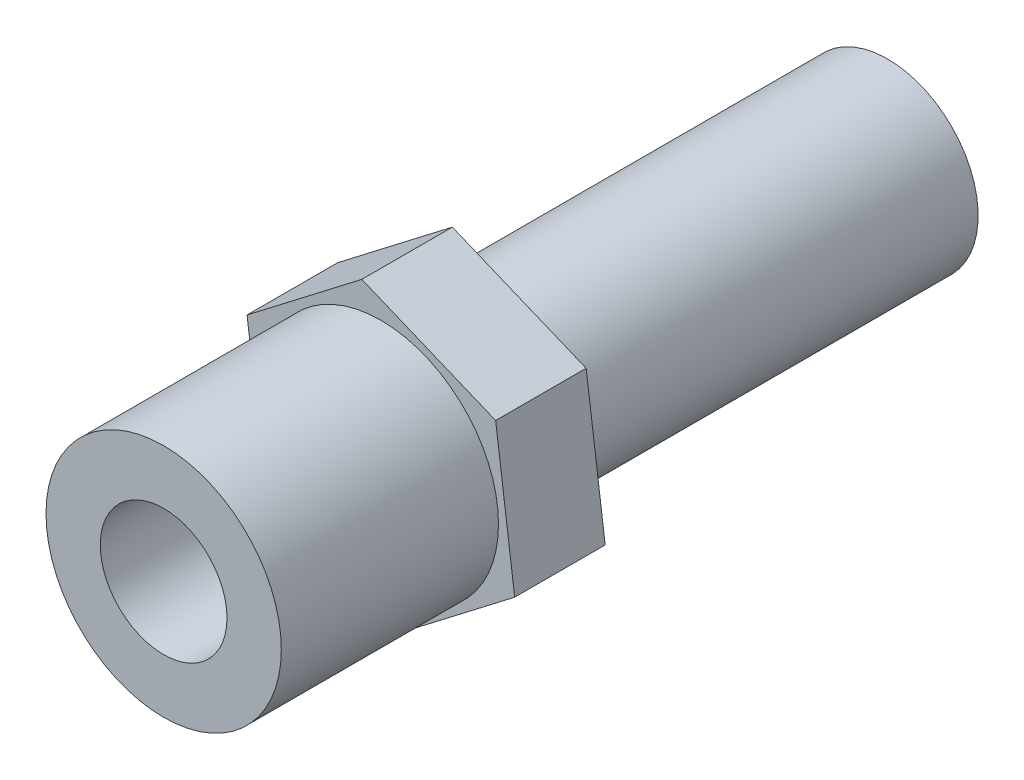
ISO-10303-21;
HEADER;
FILE_DESCRIPTION(('STEP AP214'),'2;1');
FILE_NAME('part.step','',(''),(''),'','','');
FILE_SCHEMA(('AUTOMOTIVE_DESIGN { 1 0 10303 214 1 1 1 1 }'));
ENDSEC;
DATA;
#1=APPLICATION_CONTEXT('core data for automotive mechanical design processes');
#2=APPLICATION_PROTOCOL_DEFINITION('international standard','automotive_design',2000,#1);
#3=PRODUCT_CONTEXT('',#1,'mechanical');
#4=PRODUCT('Part','Part','',(#3));
#5=PRODUCT_RELATED_PRODUCT_CATEGORY('part','',(#4));
#6=PRODUCT_DEFINITION_FORMATION('','',#4);
#7=PRODUCT_DEFINITION_CONTEXT('part definition',#1,'design');
#8=PRODUCT_DEFINITION('design','',#6,#7);
#9=PRODUCT_DEFINITION_SHAPE('','',#8);
#10=(LENGTH_UNIT() NAMED_UNIT(*) SI_UNIT(.MILLI.,.METRE.));
#11=(NAMED_UNIT(*) PLANE_ANGLE_UNIT() SI_UNIT($,.RADIAN.));
#12=(NAMED_UNIT(*) SI_UNIT($,.STERADIAN.) SOLID_ANGLE_UNIT());
#13=UNCERTAINTY_MEASURE_WITH_UNIT(LENGTH_MEASURE(1.E-05),#10,'distance_accuracy_value','');
#14=(GEOMETRIC_REPRESENTATION_CONTEXT(3) GLOBAL_UNCERTAINTY_ASSIGNED_CONTEXT((#13)) GLOBAL_UNIT_ASSIGNED_CONTEXT((#10,
#11,#12)) REPRESENTATION_CONTEXT('',''));
#15=CARTESIAN_POINT('',(0.,0.,0.));
#16=DIRECTION('',(0.,0.,1.));
#17=DIRECTION('',(1.,0.,0.));
#18=AXIS2_PLACEMENT_3D('',#15,#16,#17);
#19=CARTESIAN_POINT('',(0.,0.,12.));
#20=DIRECTION('',(0.,0.,-1.));
#21=DIRECTION('',(-1.,0.,0.));
#22=AXIS2_PLACEMENT_3D('',#19,#20,#21);
#23=CYLINDRICAL_SURFACE('',#22,6.5);
#24=CARTESIAN_POINT('',(0.,0.,12.));
#25=DIRECTION('',(0.,0.,1.));
#26=DIRECTION('',(1.,0.,0.));
#27=AXIS2_PLACEMENT_3D('',#24,#25,#26);
#28=CIRCLE('',#27,6.5);
#29=CARTESIAN_POINT('',(6.5,0.,12.));
#30=VERTEX_POINT('',#29);
#31=EDGE_CURVE('E44',#30,#30,#28,.T.);
#32=ORIENTED_EDGE('',*,*,#31,.F.);
#33=EDGE_LOOP('',(#32));
#34=FACE_BOUND('',#33,.T.);
#35=CARTESIAN_POINT('',(0.,0.,0.));
#36=DIRECTION('',(0.,0.,1.));
#37=DIRECTION('',(1.,0.,0.));
#38=AXIS2_PLACEMENT_3D('',#35,#36,#37);
#39=CIRCLE('',#38,6.5);
#40=CARTESIAN_POINT('',(6.5,0.,0.));
#41=VERTEX_POINT('',#40);
#42=EDGE_CURVE('E38',#41,#41,#39,.T.);
#43=ORIENTED_EDGE('',*,*,#42,.T.);
#44=EDGE_LOOP('',(#43));
#45=FACE_BOUND('',#44,.T.);
#46=ADVANCED_FACE('F35',(#34,#45),#23,.T.);
#47=CARTESIAN_POINT('',(0.,0.,12.));
#48=DIRECTION('',(0.,0.,1.));
#49=DIRECTION('',(1.,0.,0.));
#50=AXIS2_PLACEMENT_3D('',#47,#48,#49);
#51=PLANE('',#50);
#52=CARTESIAN_POINT('',(0.,0.,12.));
#53=DIRECTION('',(0.,0.,1.));
#54=DIRECTION('',(1.,0.,0.));
#55=AXIS2_PLACEMENT_3D('',#52,#53,#54);
#56=CIRCLE('',#55,3.5);
#57=CARTESIAN_POINT('',(3.5,0.,12.));
#58=VERTEX_POINT('',#57);
#59=EDGE_CURVE('E259',#58,#58,#56,.T.);
#60=ORIENTED_EDGE('',*,*,#59,.F.);
#61=EDGE_LOOP('',(#60));
#62=FACE_BOUND('',#61,.T.);
#63=ORIENTED_EDGE('',*,*,#31,.T.);
#64=EDGE_LOOP('',(#63));
#65=FACE_BOUND('',#64,.T.);
#66=ADVANCED_FACE('F170',(#62,#65),#51,.T.);
#67=CARTESIAN_POINT('',(6.34286297051055,4.87525274599441,-5.));
#68=DIRECTION('',(-0.991338354772871,-0.131332655330715,0.));
#69=DIRECTION('',(0.131332655330715,-0.991338354772871,0.));
#70=AXIS2_PLACEMENT_3D('',#67,#68,#69);
#71=PLANE('',#70);
#72=DIRECTION('',(0.131332655330715,-0.991338354772871,0.));
#73=VECTOR('',#72,1.);
#74=CARTESIAN_POINT('',(6.34286297051055,4.87525274599441,0.));
#75=LINE('',#74,#73);
#76=CARTESIAN_POINT('',(6.34286297051055,4.87525274599441,0.));
#77=VERTEX_POINT('',#76);
#78=CARTESIAN_POINT('',(7.39352421315628,-3.05545409218856,0.));
#79=VERTEX_POINT('',#78);
#80=EDGE_CURVE('E122',#77,#79,#75,.T.);
#81=ORIENTED_EDGE('',*,*,#80,.T.);
#82=DIRECTION('',(0.,0.,1.));
#83=VECTOR('',#82,1.);
#84=CARTESIAN_POINT('',(7.39352421315628,-3.05545409218856,-5.));
#85=LINE('',#84,#83);
#86=CARTESIAN_POINT('',(7.39352421315628,-3.05545409218856,-5.));
#87=VERTEX_POINT('',#86);
#88=EDGE_CURVE('E140',#87,#79,#85,.T.);
#89=ORIENTED_EDGE('',*,*,#88,.F.);
#90=DIRECTION('',(0.131332655330715,-0.991338354772871,0.));
#91=VECTOR('',#90,1.);
#92=CARTESIAN_POINT('',(6.34286297051055,4.87525274599441,-5.));
#93=LINE('',#92,#91);
#94=CARTESIAN_POINT('',(6.34286297051055,4.87525274599441,-5.));
#95=VERTEX_POINT('',#94);
#96=EDGE_CURVE('E133',#95,#87,#93,.T.);
#97=ORIENTED_EDGE('',*,*,#96,.F.);
#98=DIRECTION('',(0.,0.,1.));
#99=VECTOR('',#98,1.);
#100=CARTESIAN_POINT('',(6.34286297051055,4.87525274599441,-5.));
#101=LINE('',#100,#99);
#102=EDGE_CURVE('E118',#95,#77,#101,.T.);
#103=ORIENTED_EDGE('',*,*,#102,.T.);
#104=EDGE_LOOP('',(#81,#89,#97,#103));
#105=FACE_BOUND('',#104,.T.);
#106=ADVANCED_FACE('F157',(#105),#71,.F.);
#107=CARTESIAN_POINT('',(7.39352421315628,-3.05545409218856,-5.));
#108=DIRECTION('',(-0.609406593249301,0.792857871313819,0.));
#109=DIRECTION('',(-0.792857871313819,-0.609406593249301,0.));
#110=AXIS2_PLACEMENT_3D('',#107,#108,#109);
#111=PLANE('',#110);
#112=DIRECTION('',(-0.792857871313819,-0.609406593249301,0.));
#113=VECTOR('',#112,1.);
#114=CARTESIAN_POINT('',(7.39352421315628,-3.05545409218856,0.));
#115=LINE('',#114,#113);
#116=CARTESIAN_POINT('',(1.05066124264572,-7.93070683818297,0.));
#117=VERTEX_POINT('',#116);
#118=EDGE_CURVE('E125',#79,#117,#115,.T.);
#119=ORIENTED_EDGE('',*,*,#118,.T.);
#120=DIRECTION('',(0.,0.,1.));
#121=VECTOR('',#120,1.);
#122=CARTESIAN_POINT('',(1.05066124264572,-7.93070683818297,-5.));
#123=LINE('',#122,#121);
#124=CARTESIAN_POINT('',(1.05066124264572,-7.93070683818297,-5.));
#125=VERTEX_POINT('',#124);
#126=EDGE_CURVE('E137',#125,#117,#123,.T.);
#127=ORIENTED_EDGE('',*,*,#126,.F.);
#128=DIRECTION('',(-0.792857871313819,-0.609406593249301,0.));
#129=VECTOR('',#128,1.);
#130=CARTESIAN_POINT('',(7.39352421315628,-3.05545409218856,-5.));
#131=LINE('',#130,#129);
#132=EDGE_CURVE('E91',#87,#125,#131,.T.);
#133=ORIENTED_EDGE('',*,*,#132,.F.);
#134=ORIENTED_EDGE('',*,*,#88,.T.);
#135=EDGE_LOOP('',(#119,#127,#133,#134));
#136=FACE_BOUND('',#135,.T.);
#137=ADVANCED_FACE('F179',(#136),#111,.F.);
#138=CARTESIAN_POINT('',(1.05066124264572,-7.93070683818297,-5.));
#139=DIRECTION('',(0.381931761523571,0.924190526644535,0.));
#140=DIRECTION('',(-0.924190526644535,0.381931761523571,0.));
#141=AXIS2_PLACEMENT_3D('',#138,#139,#140);
#142=PLANE('',#141);
#143=DIRECTION('',(-0.924190526644535,0.381931761523571,0.));
#144=VECTOR('',#143,1.);
#145=CARTESIAN_POINT('',(1.05066124264572,-7.93070683818297,0.));
#146=LINE('',#145,#144);
#147=CARTESIAN_POINT('',(-6.34286297051055,-4.87525274599441,0.));
#148=VERTEX_POINT('',#147);
#149=EDGE_CURVE('E128',#117,#148,#146,.T.);
#150=ORIENTED_EDGE('',*,*,#149,.T.);
#151=DIRECTION('',(0.,0.,1.));
#152=VECTOR('',#151,1.);
#153=CARTESIAN_POINT('',(-6.34286297051055,-4.87525274599441,-5.));
#154=LINE('',#153,#152);
#155=CARTESIAN_POINT('',(-6.34286297051055,-4.87525274599441,-5.));
#156=VERTEX_POINT('',#155);
#157=EDGE_CURVE('E113',#156,#148,#154,.T.);
#158=ORIENTED_EDGE('',*,*,#157,.F.);
#159=DIRECTION('',(-0.924190526644535,0.381931761523571,0.));
#160=VECTOR('',#159,1.);
#161=CARTESIAN_POINT('',(1.05066124264572,-7.93070683818297,-5.));
#162=LINE('',#161,#160);
#163=EDGE_CURVE('E104',#125,#156,#162,.T.);
#164=ORIENTED_EDGE('',*,*,#163,.F.);
#165=ORIENTED_EDGE('',*,*,#126,.T.);
#166=EDGE_LOOP('',(#150,#158,#164,#165));
#167=FACE_BOUND('',#166,.T.);
#168=ADVANCED_FACE('F185',(#167),#142,.F.);
#169=CARTESIAN_POINT('',(-6.34286297051055,-4.87525274599441,-5.));
#170=DIRECTION('',(0.991338354772871,0.131332655330715,0.));
#171=DIRECTION('',(-0.131332655330715,0.991338354772871,0.));
#172=AXIS2_PLACEMENT_3D('',#169,#170,#171);
#173=PLANE('',#172);
#174=DIRECTION('',(-0.131332655330715,0.991338354772871,0.));
#175=VECTOR('',#174,1.);
#176=CARTESIAN_POINT('',(-6.34286297051055,-4.87525274599441,0.));
#177=LINE('',#176,#175);
#178=CARTESIAN_POINT('',(-7.39352421315628,3.05545409218856,0.));
#179=VERTEX_POINT('',#178);
#180=EDGE_CURVE('E112',#148,#179,#177,.T.);
#181=ORIENTED_EDGE('',*,*,#180,.T.);
#182=DIRECTION('',(0.,0.,1.));
#183=VECTOR('',#182,1.);
#184=CARTESIAN_POINT('',(-7.39352421315628,3.05545409218856,-5.));
#185=LINE('',#184,#183);
#186=CARTESIAN_POINT('',(-7.39352421315628,3.05545409218856,-5.));
#187=VERTEX_POINT('',#186);
#188=EDGE_CURVE('E109',#187,#179,#185,.T.);
#189=ORIENTED_EDGE('',*,*,#188,.F.);
#190=DIRECTION('',(-0.131332655330715,0.991338354772871,0.));
#191=VECTOR('',#190,1.);
#192=CARTESIAN_POINT('',(-6.34286297051055,-4.87525274599441,-5.));
#193=LINE('',#192,#191);
#194=EDGE_CURVE('E98',#156,#187,#193,.T.);
#195=ORIENTED_EDGE('',*,*,#194,.F.);
#196=ORIENTED_EDGE('',*,*,#157,.T.);
#197=EDGE_LOOP('',(#181,#189,#195,#196));
#198=FACE_BOUND('',#197,.T.);
#199=ADVANCED_FACE('F110',(#198),#173,.F.);
#200=CARTESIAN_POINT('',(-7.39352421315628,3.05545409218856,-5.));
#201=DIRECTION('',(0.609406593249301,-0.792857871313819,0.));
#202=DIRECTION('',(0.792857871313819,0.609406593249301,0.));
#203=AXIS2_PLACEMENT_3D('',#200,#201,#202);
#204=PLANE('',#203);
#205=DIRECTION('',(0.792857871313819,0.609406593249301,0.));
#206=VECTOR('',#205,1.);
#207=CARTESIAN_POINT('',(-7.39352421315628,3.05545409218856,0.));
#208=LINE('',#207,#206);
#209=CARTESIAN_POINT('',(-1.05066124264572,7.93070683818297,0.));
#210=VERTEX_POINT('',#209);
#211=EDGE_CURVE('E76',#179,#210,#208,.T.);
#212=ORIENTED_EDGE('',*,*,#211,.T.);
#213=DIRECTION('',(0.,0.,1.));
#214=VECTOR('',#213,1.);
#215=CARTESIAN_POINT('',(-1.05066124264572,7.93070683818297,-5.));
#216=LINE('',#215,#214);
#217=CARTESIAN_POINT('',(-1.05066124264572,7.93070683818297,-5.));
#218=VERTEX_POINT('',#217);
#219=EDGE_CURVE('E114',#218,#210,#216,.T.);
#220=ORIENTED_EDGE('',*,*,#219,.F.);
#221=DIRECTION('',(0.792857871313819,0.609406593249301,0.));
#222=VECTOR('',#221,1.);
#223=CARTESIAN_POINT('',(-7.39352421315628,3.05545409218856,-5.));
#224=LINE('',#223,#222);
#225=EDGE_CURVE('E102',#187,#218,#224,.T.);
#226=ORIENTED_EDGE('',*,*,#225,.F.);
#227=ORIENTED_EDGE('',*,*,#188,.T.);
#228=EDGE_LOOP('',(#212,#220,#226,#227));
#229=FACE_BOUND('',#228,.T.);
#230=ADVANCED_FACE('F116',(#229),#204,.F.);
#231=CARTESIAN_POINT('',(-1.05066124264572,7.93070683818297,-5.));
#232=DIRECTION('',(-0.38193176152357,-0.924190526644535,0.));
#233=DIRECTION('',(0.924190526644535,-0.38193176152357,0.));
#234=AXIS2_PLACEMENT_3D('',#231,#232,#233);
#235=PLANE('',#234);
#236=DIRECTION('',(0.924190526644535,-0.38193176152357,0.));
#237=VECTOR('',#236,1.);
#238=CARTESIAN_POINT('',(-1.05066124264572,7.93070683818297,0.));
#239=LINE('',#238,#237);
#240=EDGE_CURVE('E82',#210,#77,#239,.T.);
#241=ORIENTED_EDGE('',*,*,#240,.T.);
#242=ORIENTED_EDGE('',*,*,#102,.F.);
#243=DIRECTION('',(0.924190526644535,-0.38193176152357,0.));
#244=VECTOR('',#243,1.);
#245=CARTESIAN_POINT('',(-1.05066124264572,7.93070683818297,-5.));
#246=LINE('',#245,#244);
#247=EDGE_CURVE('E53',#218,#95,#246,.T.);
#248=ORIENTED_EDGE('',*,*,#247,.F.);
#249=ORIENTED_EDGE('',*,*,#219,.T.);
#250=EDGE_LOOP('',(#241,#242,#248,#249));
#251=FACE_BOUND('',#250,.T.);
#252=ADVANCED_FACE('F159',(#251),#235,.F.);
#253=CARTESIAN_POINT('',(0.,0.,-5.));
#254=DIRECTION('',(0.,0.,-1.));
#255=DIRECTION('',(-1.,0.,0.));
#256=AXIS2_PLACEMENT_3D('',#253,#254,#255);
#257=PLANE('',#256);
#258=CARTESIAN_POINT('',(0.,0.,-5.));
#259=DIRECTION('',(0.,0.,-1.));
#260=DIRECTION('',(-1.,0.,0.));
#261=AXIS2_PLACEMENT_3D('',#258,#259,#260);
#262=CIRCLE('',#261,5.);
#263=CARTESIAN_POINT('',(-5.,0.,-5.));
#264=VERTEX_POINT('',#263);
#265=EDGE_CURVE('E11',#264,#264,#262,.T.);
#266=ORIENTED_EDGE('',*,*,#265,.F.);
#267=EDGE_LOOP('',(#266));
#268=FACE_BOUND('',#267,.T.);
#269=ORIENTED_EDGE('',*,*,#96,.T.);
#270=ORIENTED_EDGE('',*,*,#132,.T.);
#271=ORIENTED_EDGE('',*,*,#163,.T.);
#272=ORIENTED_EDGE('',*,*,#194,.T.);
#273=ORIENTED_EDGE('',*,*,#225,.T.);
#274=ORIENTED_EDGE('',*,*,#247,.T.);
#275=EDGE_LOOP('',(#269,#270,#271,#272,#273,#274));
#276=FACE_BOUND('',#275,.T.);
#277=ADVANCED_FACE('F100',(#268,#276),#257,.T.);
#278=CARTESIAN_POINT('',(0.,0.,0.));
#279=DIRECTION('',(0.,0.,-1.));
#280=DIRECTION('',(-1.,0.,0.));
#281=AXIS2_PLACEMENT_3D('',#278,#279,#280);
#282=PLANE('',#281);
#283=ORIENTED_EDGE('',*,*,#42,.F.);
#284=EDGE_LOOP('',(#283));
#285=FACE_BOUND('',#284,.T.);
#286=ORIENTED_EDGE('',*,*,#80,.F.);
#287=ORIENTED_EDGE('',*,*,#240,.F.);
#288=ORIENTED_EDGE('',*,*,#211,.F.);
#289=ORIENTED_EDGE('',*,*,#180,.F.);
#290=ORIENTED_EDGE('',*,*,#149,.F.);
#291=ORIENTED_EDGE('',*,*,#118,.F.);
#292=EDGE_LOOP('',(#286,#287,#288,#289,#290,#291));
#293=FACE_BOUND('',#292,.T.);
#294=ADVANCED_FACE('F148',(#285,#293),#282,.F.);
#295=CARTESIAN_POINT('',(0.,0.,-28.));
#296=DIRECTION('',(0.,0.,1.));
#297=DIRECTION('',(1.,0.,0.));
#298=AXIS2_PLACEMENT_3D('',#295,#296,#297);
#299=CYLINDRICAL_SURFACE('',#298,5.);
#300=CARTESIAN_POINT('',(0.,0.,-28.));
#301=DIRECTION('',(0.,0.,-1.));
#302=DIRECTION('',(-1.,0.,0.));
#303=AXIS2_PLACEMENT_3D('',#300,#301,#302);
#304=CIRCLE('',#303,5.);
#305=CARTESIAN_POINT('',(-5.,0.,-28.));
#306=VERTEX_POINT('',#305);
#307=EDGE_CURVE('E126',#306,#306,#304,.T.);
#308=ORIENTED_EDGE('',*,*,#307,.F.);
#309=EDGE_LOOP('',(#308));
#310=FACE_BOUND('',#309,.T.);
#311=ORIENTED_EDGE('',*,*,#265,.T.);
#312=EDGE_LOOP('',(#311));
#313=FACE_BOUND('',#312,.T.);
#314=ADVANCED_FACE('F151',(#310,#313),#299,.T.);
#315=CARTESIAN_POINT('',(0.,0.,-28.));
#316=DIRECTION('',(0.,0.,-1.));
#317=DIRECTION('',(-1.,0.,0.));
#318=AXIS2_PLACEMENT_3D('',#315,#316,#317);
#319=PLANE('',#318);
#320=CARTESIAN_POINT('',(0.,0.,-28.));
#321=DIRECTION('',(0.,0.,1.));
#322=DIRECTION('',(1.,0.,0.));
#323=AXIS2_PLACEMENT_3D('',#320,#321,#322);
#324=CIRCLE('',#323,3.5);
#325=CARTESIAN_POINT('',(3.5,0.,-28.));
#326=VERTEX_POINT('',#325);
#327=EDGE_CURVE('E257',#326,#326,#324,.T.);
#328=ORIENTED_EDGE('',*,*,#327,.T.);
#329=EDGE_LOOP('',(#328));
#330=FACE_BOUND('',#329,.T.);
#331=ORIENTED_EDGE('',*,*,#307,.T.);
#332=EDGE_LOOP('',(#331));
#333=FACE_BOUND('',#332,.T.);
#334=ADVANCED_FACE('F222',(#330,#333),#319,.T.);
#335=CARTESIAN_POINT('',(0.,0.,-28.));
#336=DIRECTION('',(0.,0.,1.));
#337=DIRECTION('',(1.,0.,0.));
#338=AXIS2_PLACEMENT_3D('',#335,#336,#337);
#339=CYLINDRICAL_SURFACE('',#338,3.5);
#340=ORIENTED_EDGE('',*,*,#327,.F.);
#341=EDGE_LOOP('',(#340));
#342=FACE_BOUND('',#341,.T.);
#343=ORIENTED_EDGE('',*,*,#59,.T.);
#344=EDGE_LOOP('',(#343));
#345=FACE_BOUND('',#344,.T.);
#346=ADVANCED_FACE('F240',(#342,#345),#339,.F.);
#347=CLOSED_SHELL('',(#46,#66,#106,#137,#168,#199,#230,#252,#277,#294,#314,#334,#346));
#348=MANIFOLD_SOLID_BREP('B2',#347);
#349=ADVANCED_BREP_SHAPE_REPRESENTATION('',(#18,#348),#14);
#350=SHAPE_DEFINITION_REPRESENTATION(#9,#349);
ENDSEC;
END-ISO-10303-21;
